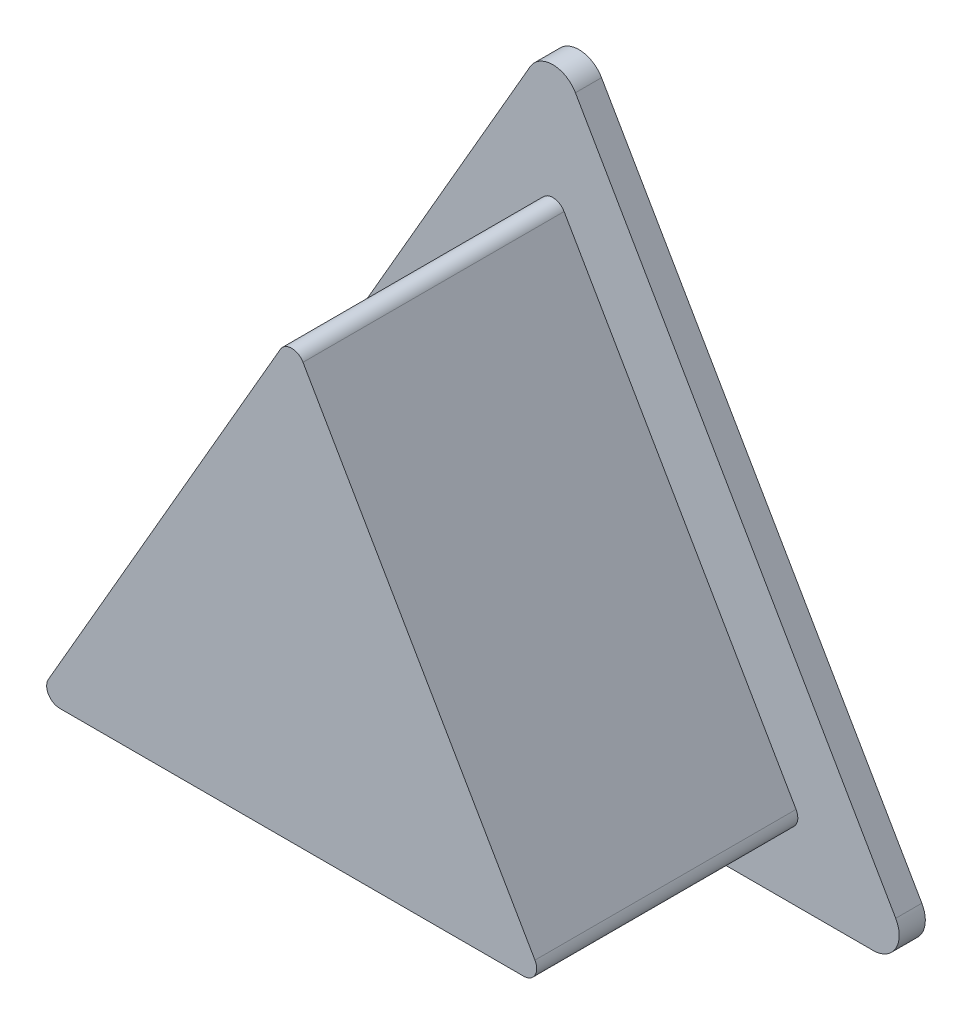
ISO-10303-21;
HEADER;
FILE_DESCRIPTION(('STEP AP214'),'2;1');
FILE_NAME('part.step','',(''),(''),'','','');
FILE_SCHEMA(('AUTOMOTIVE_DESIGN { 1 0 10303 214 1 1 1 1 }'));
ENDSEC;
DATA;
#1=APPLICATION_CONTEXT('core data for automotive mechanical design processes');
#2=APPLICATION_PROTOCOL_DEFINITION('international standard','automotive_design',2000,#1);
#3=PRODUCT_CONTEXT('',#1,'mechanical');
#4=PRODUCT('Part','Part','',(#3));
#5=PRODUCT_RELATED_PRODUCT_CATEGORY('part','',(#4));
#6=PRODUCT_DEFINITION_FORMATION('','',#4);
#7=PRODUCT_DEFINITION_CONTEXT('part definition',#1,'design');
#8=PRODUCT_DEFINITION('design','',#6,#7);
#9=PRODUCT_DEFINITION_SHAPE('','',#8);
#10=(LENGTH_UNIT() NAMED_UNIT(*) SI_UNIT(.MILLI.,.METRE.));
#11=(NAMED_UNIT(*) PLANE_ANGLE_UNIT() SI_UNIT($,.RADIAN.));
#12=(NAMED_UNIT(*) SI_UNIT($,.STERADIAN.) SOLID_ANGLE_UNIT());
#13=UNCERTAINTY_MEASURE_WITH_UNIT(LENGTH_MEASURE(1.E-05),#10,'distance_accuracy_value','');
#14=(GEOMETRIC_REPRESENTATION_CONTEXT(3) GLOBAL_UNCERTAINTY_ASSIGNED_CONTEXT((#13)) GLOBAL_UNIT_ASSIGNED_CONTEXT((#10,
#11,#12)) REPRESENTATION_CONTEXT('',''));
#15=CARTESIAN_POINT('',(0.,0.,0.));
#16=DIRECTION('',(0.,0.,1.));
#17=DIRECTION('',(1.,0.,0.));
#18=AXIS2_PLACEMENT_3D('',#15,#16,#17);
#19=CARTESIAN_POINT('',(4.875,-2.81458256229942,5.));
#20=DIRECTION('',(-0.866025403784438,-0.5,0.));
#21=DIRECTION('',(0.5,-0.866025403784438,0.));
#22=AXIS2_PLACEMENT_3D('',#19,#20,#21);
#23=PLANE('',#22);
#24=DIRECTION('',(-0.5,0.866025403784438,0.));
#25=VECTOR('',#24,1.);
#26=CARTESIAN_POINT('',(4.875,-2.81458256229942,5.));
#27=LINE('',#26,#25);
#28=CARTESIAN_POINT('',(4.65849364905389,-2.43958256229942,5.));
#29=VERTEX_POINT('',#28);
#30=CARTESIAN_POINT('',(0.216506350946109,5.25416512459885,5.));
#31=VERTEX_POINT('',#30);
#32=EDGE_CURVE('E157',#29,#31,#27,.T.);
#33=ORIENTED_EDGE('',*,*,#32,.F.);
#34=DIRECTION('',(0.,0.,-1.));
#35=VECTOR('',#34,1.);
#36=CARTESIAN_POINT('',(4.65849364905389,-2.43958256229942,5.));
#37=LINE('',#36,#35);
#38=CARTESIAN_POINT('',(4.65849364905389,-2.43958256229942,0.));
#39=VERTEX_POINT('',#38);
#40=EDGE_CURVE('E193',#29,#39,#37,.T.);
#41=ORIENTED_EDGE('',*,*,#40,.T.);
#42=DIRECTION('',(-0.5,0.866025403784438,0.));
#43=VECTOR('',#42,1.);
#44=CARTESIAN_POINT('',(4.875,-2.81458256229942,0.));
#45=LINE('',#44,#43);
#46=CARTESIAN_POINT('',(0.216506350946109,5.25416512459885,0.));
#47=VERTEX_POINT('',#46);
#48=EDGE_CURVE('E167',#39,#47,#45,.T.);
#49=ORIENTED_EDGE('',*,*,#48,.T.);
#50=DIRECTION('',(0.,0.,-1.));
#51=VECTOR('',#50,1.);
#52=CARTESIAN_POINT('',(0.216506350946109,5.25416512459885,5.));
#53=LINE('',#52,#51);
#54=EDGE_CURVE('E191',#47,#31,#53,.F.);
#55=ORIENTED_EDGE('',*,*,#54,.T.);
#56=EDGE_LOOP('',(#33,#41,#49,#55));
#57=FACE_BOUND('',#56,.T.);
#58=ADVANCED_FACE('F33',(#57),#23,.F.);
#59=CARTESIAN_POINT('',(0.,5.62916512459885,5.));
#60=DIRECTION('',(0.866025403784439,-0.5,0.));
#61=DIRECTION('',(0.5,0.866025403784439,0.));
#62=AXIS2_PLACEMENT_3D('',#59,#60,#61);
#63=PLANE('',#62);
#64=DIRECTION('',(-0.5,-0.866025403784439,0.));
#65=VECTOR('',#64,1.);
#66=CARTESIAN_POINT('',(0.,5.62916512459885,5.));
#67=LINE('',#66,#65);
#68=CARTESIAN_POINT('',(-0.21650635094611,5.25416512459885,5.));
#69=VERTEX_POINT('',#68);
#70=CARTESIAN_POINT('',(-4.65849364905389,-2.43958256229943,5.));
#71=VERTEX_POINT('',#70);
#72=EDGE_CURVE('E160',#69,#71,#67,.T.);
#73=ORIENTED_EDGE('',*,*,#72,.F.);
#74=DIRECTION('',(0.,0.,-1.));
#75=VECTOR('',#74,1.);
#76=CARTESIAN_POINT('',(-0.21650635094611,5.25416512459885,5.));
#77=LINE('',#76,#75);
#78=CARTESIAN_POINT('',(-0.21650635094611,5.25416512459885,0.));
#79=VERTEX_POINT('',#78);
#80=EDGE_CURVE('E209',#69,#79,#77,.T.);
#81=ORIENTED_EDGE('',*,*,#80,.T.);
#82=DIRECTION('',(-0.5,-0.866025403784439,0.));
#83=VECTOR('',#82,1.);
#84=CARTESIAN_POINT('',(0.,5.62916512459885,0.));
#85=LINE('',#84,#83);
#86=CARTESIAN_POINT('',(-4.65849364905389,-2.43958256229943,0.));
#87=VERTEX_POINT('',#86);
#88=EDGE_CURVE('E170',#79,#87,#85,.T.);
#89=ORIENTED_EDGE('',*,*,#88,.T.);
#90=DIRECTION('',(0.,0.,-1.));
#91=VECTOR('',#90,1.);
#92=CARTESIAN_POINT('',(-4.65849364905389,-2.43958256229943,5.));
#93=LINE('',#92,#91);
#94=EDGE_CURVE('E207',#87,#71,#93,.F.);
#95=ORIENTED_EDGE('',*,*,#94,.T.);
#96=EDGE_LOOP('',(#73,#81,#89,#95));
#97=FACE_BOUND('',#96,.T.);
#98=ADVANCED_FACE('F223',(#97),#63,.F.);
#99=CARTESIAN_POINT('',(-4.875,-2.81458256229943,5.));
#100=DIRECTION('',(0.,1.,0.));
#101=DIRECTION('',(-1.,0.,0.));
#102=AXIS2_PLACEMENT_3D('',#99,#100,#101);
#103=PLANE('',#102);
#104=DIRECTION('',(1.,0.,0.));
#105=VECTOR('',#104,1.);
#106=CARTESIAN_POINT('',(-4.875,-2.81458256229943,0.));
#107=LINE('',#106,#105);
#108=CARTESIAN_POINT('',(-4.44198729810778,-2.81458256229943,0.));
#109=VERTEX_POINT('',#108);
#110=CARTESIAN_POINT('',(4.44198729810778,-2.81458256229942,0.));
#111=VERTEX_POINT('',#110);
#112=EDGE_CURVE('E161',#109,#111,#107,.T.);
#113=ORIENTED_EDGE('',*,*,#112,.T.);
#114=DIRECTION('',(0.,0.,-1.));
#115=VECTOR('',#114,1.);
#116=CARTESIAN_POINT('',(4.44198729810778,-2.81458256229942,5.));
#117=LINE('',#116,#115);
#118=CARTESIAN_POINT('',(4.44198729810778,-2.81458256229942,5.));
#119=VERTEX_POINT('',#118);
#120=EDGE_CURVE('E199',#111,#119,#117,.F.);
#121=ORIENTED_EDGE('',*,*,#120,.T.);
#122=DIRECTION('',(1.,0.,0.));
#123=VECTOR('',#122,1.);
#124=CARTESIAN_POINT('',(-4.875,-2.81458256229943,5.));
#125=LINE('',#124,#123);
#126=CARTESIAN_POINT('',(-4.44198729810778,-2.81458256229943,5.));
#127=VERTEX_POINT('',#126);
#128=EDGE_CURVE('E164',#127,#119,#125,.T.);
#129=ORIENTED_EDGE('',*,*,#128,.F.);
#130=DIRECTION('',(0.,0.,-1.));
#131=VECTOR('',#130,1.);
#132=CARTESIAN_POINT('',(-4.44198729810778,-2.81458256229943,5.));
#133=LINE('',#132,#131);
#134=EDGE_CURVE('E196',#127,#109,#133,.T.);
#135=ORIENTED_EDGE('',*,*,#134,.T.);
#136=EDGE_LOOP('',(#113,#121,#129,#135));
#137=FACE_BOUND('',#136,.T.);
#138=ADVANCED_FACE('F230',(#137),#103,.F.);
#139=CARTESIAN_POINT('',(0.,0.,5.));
#140=DIRECTION('',(0.,0.,1.));
#141=DIRECTION('',(1.,0.,0.));
#142=AXIS2_PLACEMENT_3D('',#139,#140,#141);
#143=PLANE('',#142);
#144=ORIENTED_EDGE('',*,*,#128,.T.);
#145=CARTESIAN_POINT('',(4.44198729810778,-2.56458256229942,5.));
#146=DIRECTION('',(0.,0.,1.));
#147=DIRECTION('',(1.,0.,0.));
#148=AXIS2_PLACEMENT_3D('',#145,#146,#147);
#149=CIRCLE('',#148,0.25);
#150=EDGE_CURVE('E205',#119,#29,#149,.T.);
#151=ORIENTED_EDGE('',*,*,#150,.T.);
#152=ORIENTED_EDGE('',*,*,#32,.T.);
#153=CARTESIAN_POINT('',(0.,5.12916512459885,5.));
#154=DIRECTION('',(0.,0.,1.));
#155=DIRECTION('',(1.,0.,0.));
#156=AXIS2_PLACEMENT_3D('',#153,#154,#155);
#157=CIRCLE('',#156,0.25);
#158=EDGE_CURVE('E203',#31,#69,#157,.T.);
#159=ORIENTED_EDGE('',*,*,#158,.T.);
#160=ORIENTED_EDGE('',*,*,#72,.T.);
#161=CARTESIAN_POINT('',(-4.44198729810778,-2.56458256229943,5.));
#162=DIRECTION('',(0.,0.,1.));
#163=DIRECTION('',(1.,0.,0.));
#164=AXIS2_PLACEMENT_3D('',#161,#162,#163);
#165=CIRCLE('',#164,0.25);
#166=EDGE_CURVE('E201',#71,#127,#165,.T.);
#167=ORIENTED_EDGE('',*,*,#166,.T.);
#168=EDGE_LOOP('',(#144,#151,#152,#159,#160,#167));
#169=FACE_BOUND('',#168,.T.);
#170=ADVANCED_FACE('F220',(#169),#143,.T.);
#171=CARTESIAN_POINT('',(0.,0.,0.));
#172=DIRECTION('',(0.,0.,-1.));
#173=DIRECTION('',(-1.,0.,0.));
#174=AXIS2_PLACEMENT_3D('',#171,#172,#173);
#175=PLANE('',#174);
#176=DIRECTION('',(-1.,0.,0.));
#177=VECTOR('',#176,1.);
#178=CARTESIAN_POINT('',(7.,-4.04145188432738,0.));
#179=LINE('',#178,#177);
#180=CARTESIAN_POINT('',(6.13397459621556,-4.04145188432738,0.));
#181=VERTEX_POINT('',#180);
#182=CARTESIAN_POINT('',(-6.13397459621556,-4.04145188432738,0.));
#183=VERTEX_POINT('',#182);
#184=EDGE_CURVE('E138',#181,#183,#179,.T.);
#185=ORIENTED_EDGE('',*,*,#184,.F.);
#186=CARTESIAN_POINT('',(6.13397459621556,-3.54145188432738,0.));
#187=DIRECTION('',(0.,0.,-1.));
#188=DIRECTION('',(-1.,0.,0.));
#189=AXIS2_PLACEMENT_3D('',#186,#187,#188);
#190=CIRCLE('',#189,0.5);
#191=CARTESIAN_POINT('',(6.56698729810778,-3.29145188432738,0.));
#192=VERTEX_POINT('',#191);
#193=EDGE_CURVE('E121',#181,#192,#190,.F.);
#194=ORIENTED_EDGE('',*,*,#193,.T.);
#195=DIRECTION('',(0.5,-0.866025403784439,0.));
#196=VECTOR('',#195,1.);
#197=CARTESIAN_POINT('',(0.,8.08290376865476,0.));
#198=LINE('',#197,#196);
#199=CARTESIAN_POINT('',(0.433012701892221,7.33290376865476,0.));
#200=VERTEX_POINT('',#199);
#201=EDGE_CURVE('E148',#200,#192,#198,.T.);
#202=ORIENTED_EDGE('',*,*,#201,.F.);
#203=CARTESIAN_POINT('',(0.,7.08290376865476,0.));
#204=DIRECTION('',(0.,0.,-1.));
#205=DIRECTION('',(-1.,0.,0.));
#206=AXIS2_PLACEMENT_3D('',#203,#204,#205);
#207=CIRCLE('',#206,0.5);
#208=CARTESIAN_POINT('',(-0.433012701892221,7.33290376865476,0.));
#209=VERTEX_POINT('',#208);
#210=EDGE_CURVE('E142',#200,#209,#207,.F.);
#211=ORIENTED_EDGE('',*,*,#210,.T.);
#212=DIRECTION('',(0.5,0.866025403784438,0.));
#213=VECTOR('',#212,1.);
#214=CARTESIAN_POINT('',(-7.,-4.04145188432738,0.));
#215=LINE('',#214,#213);
#216=CARTESIAN_POINT('',(-6.56698729810778,-3.29145188432738,0.));
#217=VERTEX_POINT('',#216);
#218=EDGE_CURVE('E153',#217,#209,#215,.T.);
#219=ORIENTED_EDGE('',*,*,#218,.F.);
#220=CARTESIAN_POINT('',(-6.13397459621556,-3.54145188432738,0.));
#221=DIRECTION('',(0.,0.,-1.));
#222=DIRECTION('',(-1.,0.,0.));
#223=AXIS2_PLACEMENT_3D('',#220,#221,#222);
#224=CIRCLE('',#223,0.5);
#225=EDGE_CURVE('E132',#217,#183,#224,.F.);
#226=ORIENTED_EDGE('',*,*,#225,.T.);
#227=EDGE_LOOP('',(#185,#194,#202,#211,#219,#226));
#228=FACE_BOUND('',#227,.T.);
#229=ORIENTED_EDGE('',*,*,#88,.F.);
#230=CARTESIAN_POINT('',(0.,5.12916512459885,0.));
#231=DIRECTION('',(0.,0.,-1.));
#232=DIRECTION('',(-1.,0.,0.));
#233=AXIS2_PLACEMENT_3D('',#230,#231,#232);
#234=CIRCLE('',#233,0.25);
#235=EDGE_CURVE('E41',#79,#47,#234,.T.);
#236=ORIENTED_EDGE('',*,*,#235,.T.);
#237=ORIENTED_EDGE('',*,*,#48,.F.);
#238=CARTESIAN_POINT('',(4.44198729810778,-2.56458256229942,0.));
#239=DIRECTION('',(0.,0.,-1.));
#240=DIRECTION('',(-1.,0.,0.));
#241=AXIS2_PLACEMENT_3D('',#238,#239,#240);
#242=CIRCLE('',#241,0.25);
#243=EDGE_CURVE('E211',#39,#111,#242,.T.);
#244=ORIENTED_EDGE('',*,*,#243,.T.);
#245=ORIENTED_EDGE('',*,*,#112,.F.);
#246=CARTESIAN_POINT('',(-4.44198729810778,-2.56458256229943,0.));
#247=DIRECTION('',(0.,0.,-1.));
#248=DIRECTION('',(-1.,0.,0.));
#249=AXIS2_PLACEMENT_3D('',#246,#247,#248);
#250=CIRCLE('',#249,0.25);
#251=EDGE_CURVE('E11',#109,#87,#250,.T.);
#252=ORIENTED_EDGE('',*,*,#251,.T.);
#253=EDGE_LOOP('',(#229,#236,#237,#244,#245,#252));
#254=FACE_BOUND('',#253,.T.);
#255=ADVANCED_FACE('F145',(#228,#254),#175,.F.);
#256=CARTESIAN_POINT('',(-7.,-4.04145188432738,-0.5));
#257=DIRECTION('',(0.866025403784439,-0.5,0.));
#258=DIRECTION('',(0.5,0.866025403784439,0.));
#259=AXIS2_PLACEMENT_3D('',#256,#257,#258);
#260=PLANE('',#259);
#261=DIRECTION('',(0.5,0.866025403784438,0.));
#262=VECTOR('',#261,1.);
#263=CARTESIAN_POINT('',(-7.,-4.04145188432738,-0.5));
#264=LINE('',#263,#262);
#265=CARTESIAN_POINT('',(-6.56698729810778,-3.29145188432738,-0.5));
#266=VERTEX_POINT('',#265);
#267=CARTESIAN_POINT('',(-0.433012701892221,7.33290376865476,-0.5));
#268=VERTEX_POINT('',#267);
#269=EDGE_CURVE('E147',#266,#268,#264,.T.);
#270=ORIENTED_EDGE('',*,*,#269,.F.);
#271=DIRECTION('',(0.,0.,1.));
#272=VECTOR('',#271,1.);
#273=CARTESIAN_POINT('',(-6.56698729810778,-3.29145188432738,-0.5));
#274=LINE('',#273,#272);
#275=EDGE_CURVE('E188',#266,#217,#274,.T.);
#276=ORIENTED_EDGE('',*,*,#275,.T.);
#277=ORIENTED_EDGE('',*,*,#218,.T.);
#278=DIRECTION('',(0.,0.,1.));
#279=VECTOR('',#278,1.);
#280=CARTESIAN_POINT('',(-0.433012701892218,7.33290376865476,-0.5));
#281=LINE('',#280,#279);
#282=EDGE_CURVE('E186',#209,#268,#281,.F.);
#283=ORIENTED_EDGE('',*,*,#282,.T.);
#284=EDGE_LOOP('',(#270,#276,#277,#283));
#285=FACE_BOUND('',#284,.T.);
#286=ADVANCED_FACE('F266',(#285),#260,.F.);
#287=CARTESIAN_POINT('',(0.,8.08290376865476,-0.5));
#288=DIRECTION('',(-0.866025403784439,-0.5,0.));
#289=DIRECTION('',(0.5,-0.866025403784439,0.));
#290=AXIS2_PLACEMENT_3D('',#287,#288,#289);
#291=PLANE('',#290);
#292=ORIENTED_EDGE('',*,*,#201,.T.);
#293=DIRECTION('',(0.,0.,1.));
#294=VECTOR('',#293,1.);
#295=CARTESIAN_POINT('',(6.56698729810778,-3.29145188432739,-0.5));
#296=LINE('',#295,#294);
#297=CARTESIAN_POINT('',(6.56698729810778,-3.29145188432738,-0.5));
#298=VERTEX_POINT('',#297);
#299=EDGE_CURVE('E126',#192,#298,#296,.F.);
#300=ORIENTED_EDGE('',*,*,#299,.T.);
#301=DIRECTION('',(0.5,-0.866025403784439,0.));
#302=VECTOR('',#301,1.);
#303=CARTESIAN_POINT('',(0.,8.08290376865476,-0.5));
#304=LINE('',#303,#302);
#305=CARTESIAN_POINT('',(0.433012701892221,7.33290376865476,-0.5));
#306=VERTEX_POINT('',#305);
#307=EDGE_CURVE('E151',#306,#298,#304,.T.);
#308=ORIENTED_EDGE('',*,*,#307,.F.);
#309=DIRECTION('',(0.,0.,1.));
#310=VECTOR('',#309,1.);
#311=CARTESIAN_POINT('',(0.433012701892221,7.33290376865476,-0.5));
#312=LINE('',#311,#310);
#313=EDGE_CURVE('E131',#306,#200,#312,.T.);
#314=ORIENTED_EDGE('',*,*,#313,.T.);
#315=EDGE_LOOP('',(#292,#300,#308,#314));
#316=FACE_BOUND('',#315,.T.);
#317=ADVANCED_FACE('F272',(#316),#291,.F.);
#318=CARTESIAN_POINT('',(7.,-4.04145188432738,-0.5));
#319=DIRECTION('',(0.,1.,0.));
#320=DIRECTION('',(-1.,0.,0.));
#321=AXIS2_PLACEMENT_3D('',#318,#319,#320);
#322=PLANE('',#321);
#323=DIRECTION('',(-1.,0.,0.));
#324=VECTOR('',#323,1.);
#325=CARTESIAN_POINT('',(7.,-4.04145188432738,-0.5));
#326=LINE('',#325,#324);
#327=CARTESIAN_POINT('',(6.13397459621556,-4.04145188432738,-0.5));
#328=VERTEX_POINT('',#327);
#329=CARTESIAN_POINT('',(-6.13397459621556,-4.04145188432738,-0.5));
#330=VERTEX_POINT('',#329);
#331=EDGE_CURVE('E141',#328,#330,#326,.T.);
#332=ORIENTED_EDGE('',*,*,#331,.F.);
#333=DIRECTION('',(0.,0.,1.));
#334=VECTOR('',#333,1.);
#335=CARTESIAN_POINT('',(6.13397459621556,-4.04145188432738,-0.5));
#336=LINE('',#335,#334);
#337=EDGE_CURVE('E125',#328,#181,#336,.T.);
#338=ORIENTED_EDGE('',*,*,#337,.T.);
#339=ORIENTED_EDGE('',*,*,#184,.T.);
#340=DIRECTION('',(0.,0.,1.));
#341=VECTOR('',#340,1.);
#342=CARTESIAN_POINT('',(-6.13397459621556,-4.04145188432738,-0.5));
#343=LINE('',#342,#341);
#344=EDGE_CURVE('E143',#183,#330,#343,.F.);
#345=ORIENTED_EDGE('',*,*,#344,.T.);
#346=EDGE_LOOP('',(#332,#338,#339,#345));
#347=FACE_BOUND('',#346,.T.);
#348=ADVANCED_FACE('F137',(#347),#322,.F.);
#349=CARTESIAN_POINT('',(0.,0.,-0.5));
#350=DIRECTION('',(0.,0.,-1.));
#351=DIRECTION('',(-1.,0.,0.));
#352=AXIS2_PLACEMENT_3D('',#349,#350,#351);
#353=PLANE('',#352);
#354=CARTESIAN_POINT('',(0.,0.,-0.5));
#355=DIRECTION('',(0.,0.,-1.));
#356=DIRECTION('',(-1.,0.,0.));
#357=AXIS2_PLACEMENT_3D('',#354,#355,#356);
#358=CIRCLE('',#357,1.75);
#359=CARTESIAN_POINT('',(-1.75,0.,-0.5));
#360=VERTEX_POINT('',#359);
#361=EDGE_CURVE('E278',#360,#360,#358,.T.);
#362=ORIENTED_EDGE('',*,*,#361,.F.);
#363=EDGE_LOOP('',(#362));
#364=FACE_BOUND('',#363,.T.);
#365=ORIENTED_EDGE('',*,*,#307,.T.);
#366=CARTESIAN_POINT('',(6.13397459621556,-3.54145188432738,-0.5));
#367=DIRECTION('',(0.,0.,-1.));
#368=DIRECTION('',(-1.,0.,0.));
#369=AXIS2_PLACEMENT_3D('',#366,#367,#368);
#370=CIRCLE('',#369,0.5);
#371=EDGE_CURVE('E184',#298,#328,#370,.T.);
#372=ORIENTED_EDGE('',*,*,#371,.T.);
#373=ORIENTED_EDGE('',*,*,#331,.T.);
#374=CARTESIAN_POINT('',(-6.13397459621556,-3.54145188432738,-0.5));
#375=DIRECTION('',(0.,0.,-1.));
#376=DIRECTION('',(-1.,0.,0.));
#377=AXIS2_PLACEMENT_3D('',#374,#375,#376);
#378=CIRCLE('',#377,0.5);
#379=EDGE_CURVE('E182',#330,#266,#378,.T.);
#380=ORIENTED_EDGE('',*,*,#379,.T.);
#381=ORIENTED_EDGE('',*,*,#269,.T.);
#382=CARTESIAN_POINT('',(0.,7.08290376865476,-0.5));
#383=DIRECTION('',(0.,0.,-1.));
#384=DIRECTION('',(-1.,0.,0.));
#385=AXIS2_PLACEMENT_3D('',#382,#383,#384);
#386=CIRCLE('',#385,0.5);
#387=EDGE_CURVE('E180',#268,#306,#386,.T.);
#388=ORIENTED_EDGE('',*,*,#387,.T.);
#389=EDGE_LOOP('',(#365,#372,#373,#380,#381,#388));
#390=FACE_BOUND('',#389,.T.);
#391=ADVANCED_FACE('F254',(#364,#390),#353,.T.);
#392=CARTESIAN_POINT('',(6.13397459621556,-3.54145188432738,-0.5));
#393=DIRECTION('',(0.,0.,1.));
#394=DIRECTION('',(1.,0.,0.));
#395=AXIS2_PLACEMENT_3D('',#392,#393,#394);
#396=CYLINDRICAL_SURFACE('',#395,0.5);
#397=ORIENTED_EDGE('',*,*,#371,.F.);
#398=ORIENTED_EDGE('',*,*,#299,.F.);
#399=ORIENTED_EDGE('',*,*,#193,.F.);
#400=ORIENTED_EDGE('',*,*,#337,.F.);
#401=EDGE_LOOP('',(#397,#398,#399,#400));
#402=FACE_BOUND('',#401,.T.);
#403=ADVANCED_FACE('F124',(#402),#396,.T.);
#404=CARTESIAN_POINT('',(-6.13397459621556,-3.54145188432738,-0.5));
#405=DIRECTION('',(0.,0.,1.));
#406=DIRECTION('',(1.,0.,0.));
#407=AXIS2_PLACEMENT_3D('',#404,#405,#406);
#408=CYLINDRICAL_SURFACE('',#407,0.5);
#409=ORIENTED_EDGE('',*,*,#379,.F.);
#410=ORIENTED_EDGE('',*,*,#344,.F.);
#411=ORIENTED_EDGE('',*,*,#225,.F.);
#412=ORIENTED_EDGE('',*,*,#275,.F.);
#413=EDGE_LOOP('',(#409,#410,#411,#412));
#414=FACE_BOUND('',#413,.T.);
#415=ADVANCED_FACE('F241',(#414),#408,.T.);
#416=CARTESIAN_POINT('',(0.,7.08290376865476,-0.5));
#417=DIRECTION('',(0.,0.,1.));
#418=DIRECTION('',(1.,0.,0.));
#419=AXIS2_PLACEMENT_3D('',#416,#417,#418);
#420=CYLINDRICAL_SURFACE('',#419,0.5);
#421=ORIENTED_EDGE('',*,*,#387,.F.);
#422=ORIENTED_EDGE('',*,*,#282,.F.);
#423=ORIENTED_EDGE('',*,*,#210,.F.);
#424=ORIENTED_EDGE('',*,*,#313,.F.);
#425=EDGE_LOOP('',(#421,#422,#423,#424));
#426=FACE_BOUND('',#425,.T.);
#427=ADVANCED_FACE('F235',(#426),#420,.T.);
#428=CARTESIAN_POINT('',(4.44198729810778,-2.56458256229942,5.));
#429=DIRECTION('',(0.,0.,-1.));
#430=DIRECTION('',(-1.,0.,0.));
#431=AXIS2_PLACEMENT_3D('',#428,#429,#430);
#432=CYLINDRICAL_SURFACE('',#431,0.25);
#433=ORIENTED_EDGE('',*,*,#150,.F.);
#434=ORIENTED_EDGE('',*,*,#120,.F.);
#435=ORIENTED_EDGE('',*,*,#243,.F.);
#436=ORIENTED_EDGE('',*,*,#40,.F.);
#437=EDGE_LOOP('',(#433,#434,#435,#436));
#438=FACE_BOUND('',#437,.T.);
#439=ADVANCED_FACE('F233',(#438),#432,.T.);
#440=CARTESIAN_POINT('',(0.,5.12916512459885,5.));
#441=DIRECTION('',(0.,0.,-1.));
#442=DIRECTION('',(-1.,0.,0.));
#443=AXIS2_PLACEMENT_3D('',#440,#441,#442);
#444=CYLINDRICAL_SURFACE('',#443,0.25);
#445=ORIENTED_EDGE('',*,*,#158,.F.);
#446=ORIENTED_EDGE('',*,*,#54,.F.);
#447=ORIENTED_EDGE('',*,*,#235,.F.);
#448=ORIENTED_EDGE('',*,*,#80,.F.);
#449=EDGE_LOOP('',(#445,#446,#447,#448));
#450=FACE_BOUND('',#449,.T.);
#451=ADVANCED_FACE('F217',(#450),#444,.T.);
#452=CARTESIAN_POINT('',(-4.44198729810778,-2.56458256229943,5.));
#453=DIRECTION('',(0.,0.,-1.));
#454=DIRECTION('',(-1.,0.,0.));
#455=AXIS2_PLACEMENT_3D('',#452,#453,#454);
#456=CYLINDRICAL_SURFACE('',#455,0.25);
#457=ORIENTED_EDGE('',*,*,#166,.F.);
#458=ORIENTED_EDGE('',*,*,#94,.F.);
#459=ORIENTED_EDGE('',*,*,#251,.F.);
#460=ORIENTED_EDGE('',*,*,#134,.F.);
#461=EDGE_LOOP('',(#457,#458,#459,#460));
#462=FACE_BOUND('',#461,.T.);
#463=ADVANCED_FACE('F35',(#462),#456,.T.);
#464=CARTESIAN_POINT('',(0.,0.,0.25));
#465=DIRECTION('',(0.,0.,-1.));
#466=DIRECTION('',(-1.,0.,0.));
#467=AXIS2_PLACEMENT_3D('',#464,#465,#466);
#468=CYLINDRICAL_SURFACE('',#467,1.75);
#469=CARTESIAN_POINT('',(0.,0.,0.25));
#470=DIRECTION('',(0.,0.,-1.));
#471=DIRECTION('',(-1.,0.,0.));
#472=AXIS2_PLACEMENT_3D('',#469,#470,#471);
#473=CIRCLE('',#472,1.75);
#474=CARTESIAN_POINT('',(-1.75,0.,0.25));
#475=VERTEX_POINT('',#474);
#476=EDGE_CURVE('E276',#475,#475,#473,.T.);
#477=ORIENTED_EDGE('',*,*,#476,.F.);
#478=EDGE_LOOP('',(#477));
#479=FACE_BOUND('',#478,.T.);
#480=ORIENTED_EDGE('',*,*,#361,.T.);
#481=EDGE_LOOP('',(#480));
#482=FACE_BOUND('',#481,.T.);
#483=ADVANCED_FACE('F285',(#479,#482),#468,.F.);
#484=CARTESIAN_POINT('',(0.,0.,0.25));
#485=DIRECTION('',(0.,0.,-1.));
#486=DIRECTION('',(-1.,0.,0.));
#487=AXIS2_PLACEMENT_3D('',#484,#485,#486);
#488=PLANE('',#487);
#489=ORIENTED_EDGE('',*,*,#476,.T.);
#490=EDGE_LOOP('',(#489));
#491=FACE_BOUND('',#490,.T.);
#492=ADVANCED_FACE('F388',(#491),#488,.T.);
#493=CLOSED_SHELL('',(#58,#98,#138,#170,#255,#286,#317,#348,#391,#403,#415,#427,#439,#451,#463,
#483,#492));
#494=MANIFOLD_SOLID_BREP('B2',#493);
#495=ADVANCED_BREP_SHAPE_REPRESENTATION('',(#18,#494),#14);
#496=SHAPE_DEFINITION_REPRESENTATION(#9,#495);
ENDSEC;
END-ISO-10303-21;
